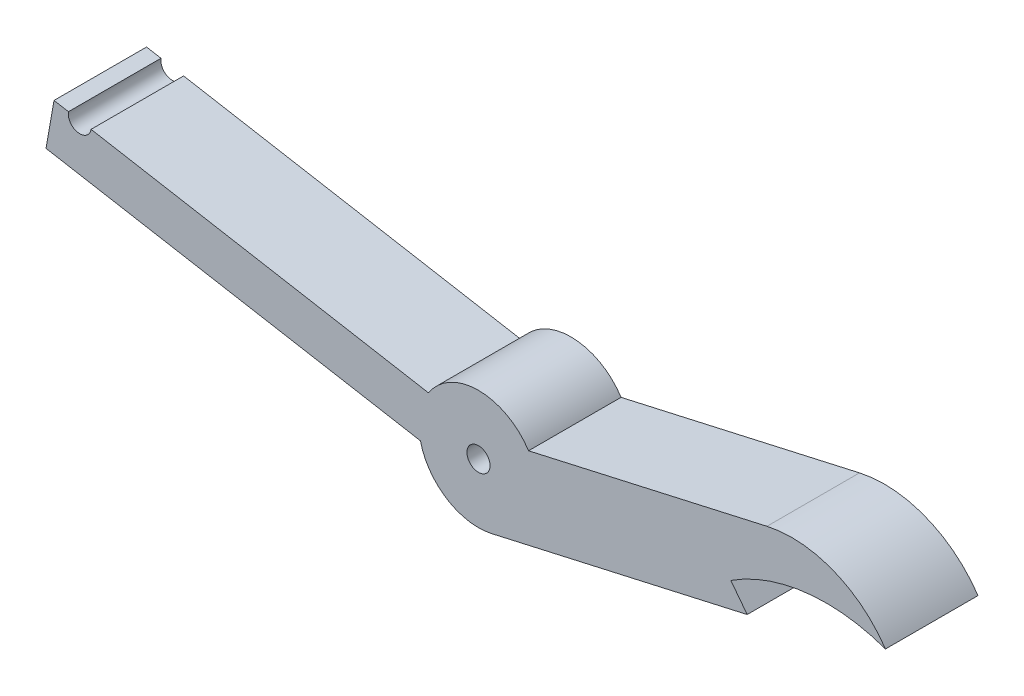
ISO-10303-21;
HEADER;
FILE_DESCRIPTION(('STEP AP214'),'2;1');
FILE_NAME('part.step','',(''),(''),'','','');
FILE_SCHEMA(('AUTOMOTIVE_DESIGN { 1 0 10303 214 1 1 1 1 }'));
ENDSEC;
DATA;
#1=APPLICATION_CONTEXT('core data for automotive mechanical design processes');
#2=APPLICATION_PROTOCOL_DEFINITION('international standard','automotive_design',2000,#1);
#3=PRODUCT_CONTEXT('',#1,'mechanical');
#4=PRODUCT('Part','Part','',(#3));
#5=PRODUCT_RELATED_PRODUCT_CATEGORY('part','',(#4));
#6=PRODUCT_DEFINITION_FORMATION('','',#4);
#7=PRODUCT_DEFINITION_CONTEXT('part definition',#1,'design');
#8=PRODUCT_DEFINITION('design','',#6,#7);
#9=PRODUCT_DEFINITION_SHAPE('','',#8);
#10=(LENGTH_UNIT() NAMED_UNIT(*) SI_UNIT(.MILLI.,.METRE.));
#11=(NAMED_UNIT(*) PLANE_ANGLE_UNIT() SI_UNIT($,.RADIAN.));
#12=(NAMED_UNIT(*) SI_UNIT($,.STERADIAN.) SOLID_ANGLE_UNIT());
#13=UNCERTAINTY_MEASURE_WITH_UNIT(LENGTH_MEASURE(1.E-05),#10,'distance_accuracy_value','');
#14=(GEOMETRIC_REPRESENTATION_CONTEXT(3) GLOBAL_UNCERTAINTY_ASSIGNED_CONTEXT((#13)) GLOBAL_UNIT_ASSIGNED_CONTEXT((#10,
#11,#12)) REPRESENTATION_CONTEXT('',''));
#15=CARTESIAN_POINT('',(0.,0.,0.));
#16=DIRECTION('',(0.,0.,1.));
#17=DIRECTION('',(1.,0.,0.));
#18=AXIS2_PLACEMENT_3D('',#15,#16,#17);
#19=CARTESIAN_POINT('',(0.,0.,6.35));
#20=DIRECTION('',(0.,0.,1.));
#21=DIRECTION('',(1.,0.,0.));
#22=AXIS2_PLACEMENT_3D('',#19,#20,#21);
#23=PLANE('',#22);
#24=CARTESIAN_POINT('',(0.,0.,6.35));
#25=DIRECTION('',(0.,0.,1.));
#26=DIRECTION('',(1.,0.,0.));
#27=AXIS2_PLACEMENT_3D('',#24,#25,#26);
#28=CIRCLE('',#27,8.1661);
#29=CARTESIAN_POINT('',(6.86979140393997,4.4148788518319,6.35));
#30=VERTEX_POINT('',#29);
#31=CARTESIAN_POINT('',(-6.85796712096746,4.43322412897535,6.35));
#32=VERTEX_POINT('',#31);
#33=EDGE_CURVE('E179',#30,#32,#28,.T.);
#34=ORIENTED_EDGE('',*,*,#33,.T.);
#35=DIRECTION('',(-0.984807753012208,0.173648177666931,0.));
#36=VECTOR('',#35,1.);
#37=CARTESIAN_POINT('',(-6.85796712096746,4.43322412897535,6.35));
#38=LINE('',#37,#36);
#39=CARTESIAN_POINT('',(-53.1755197369553,12.600258335558,6.35));
#40=VERTEX_POINT('',#39);
#41=EDGE_CURVE('E107',#32,#40,#38,.T.);
#42=ORIENTED_EDGE('',*,*,#41,.T.);
#43=CARTESIAN_POINT('',(-54.7263949863989,12.8737194857478,6.35));
#44=DIRECTION('',(0.,0.,-1.));
#45=DIRECTION('',(1.,0.,0.));
#46=AXIS2_PLACEMENT_3D('',#43,#44,#45);
#47=CIRCLE('',#46,1.5748);
#48=CARTESIAN_POINT('',(-56.2772702358425,13.1471806359377,6.35));
#49=VERTEX_POINT('',#48);
#50=EDGE_CURVE('E206',#40,#49,#47,.T.);
#51=ORIENTED_EDGE('',*,*,#50,.T.);
#52=DIRECTION('',(-0.984807753012208,0.173648177666931,0.));
#53=VECTOR('',#52,1.);
#54=CARTESIAN_POINT('',(-56.2772702358425,13.1471806359377,6.35));
#55=LINE('',#54,#53);
#56=CARTESIAN_POINT('',(-58.2573191822893,13.4963166883197,6.35));
#57=VERTEX_POINT('',#56);
#58=EDGE_CURVE('E225',#49,#57,#55,.T.);
#59=ORIENTED_EDGE('',*,*,#58,.T.);
#60=DIRECTION('',(-0.173648177666931,-0.984807753012208,0.));
#61=VECTOR('',#60,1.);
#62=CARTESIAN_POINT('',(-58.2573191822893,13.4963166883197,6.35));
#63=LINE('',#62,#61);
#64=CARTESIAN_POINT('',(-59.3599851104743,7.24278745669213,6.35));
#65=VERTEX_POINT('',#64);
#66=EDGE_CURVE('E222',#57,#65,#63,.T.);
#67=ORIENTED_EDGE('',*,*,#66,.T.);
#68=DIRECTION('',(0.984807753012208,-0.17364817766693,0.));
#69=VECTOR('',#68,1.);
#70=CARTESIAN_POINT('',(-7.96063304915247,-1.82030510265216,6.35));
#71=LINE('',#70,#69);
#72=CARTESIAN_POINT('',(-7.96063304915247,-1.82030510265216,6.35));
#73=VERTEX_POINT('',#72);
#74=EDGE_CURVE('E224',#65,#73,#71,.T.);
#75=ORIENTED_EDGE('',*,*,#74,.T.);
#76=CARTESIAN_POINT('',(0.,0.,6.35));
#77=DIRECTION('',(0.,0.,1.));
#78=DIRECTION('',(1.,0.,0.));
#79=AXIS2_PLACEMENT_3D('',#76,#77,#78);
#80=CIRCLE('',#79,8.1661);
#81=CARTESIAN_POINT('',(1.76685632543537,-7.97266630025797,6.35));
#82=VERTEX_POINT('',#81);
#83=EDGE_CURVE('E227',#73,#82,#80,.T.);
#84=ORIENTED_EDGE('',*,*,#83,.T.);
#85=DIRECTION('',(0.975461826345997,0.220168629331548,0.));
#86=VECTOR('',#85,1.);
#87=CARTESIAN_POINT('',(1.76685632543537,-7.97266630025796,6.35));
#88=LINE('',#87,#86);
#89=CARTESIAN_POINT('',(36.8810507217631,-0.0471444176837717,6.35));
#90=VERTEX_POINT('',#89);
#91=EDGE_CURVE('E233',#82,#90,#88,.T.);
#92=ORIENTED_EDGE('',*,*,#91,.T.);
#93=DIRECTION('',(-0.607545349691304,0.794284991718005,0.));
#94=VECTOR('',#93,1.);
#95=CARTESIAN_POINT('',(36.8810507217631,-0.0471444176837717,6.35));
#96=LINE('',#95,#94);
#97=CARTESIAN_POINT('',(34.6351859776387,2.88902596135538,6.35));
#98=VERTEX_POINT('',#97);
#99=EDGE_CURVE('E138',#90,#98,#96,.T.);
#100=ORIENTED_EDGE('',*,*,#99,.T.);
#101=CARTESIAN_POINT('',(47.7363851359241,-17.3746232809441,6.35));
#102=DIRECTION('',(0.,0.,-1.));
#103=DIRECTION('',(-1.,0.,0.));
#104=AXIS2_PLACEMENT_3D('',#101,#102,#103);
#105=CIRCLE('',#104,24.1300000000001);
#106=CARTESIAN_POINT('',(55.8608218217205,5.34652168445081,6.35));
#107=VERTEX_POINT('',#106);
#108=EDGE_CURVE('E132',#98,#107,#105,.T.);
#109=ORIENTED_EDGE('',*,*,#108,.T.);
#110=CARTESIAN_POINT('',(43.0085552868671,-3.31896312374581,6.35));
#111=DIRECTION('',(0.,0.,1.));
#112=DIRECTION('',(-1.,0.,0.));
#113=AXIS2_PLACEMENT_3D('',#110,#111,#112);
#114=CIRCLE('',#113,15.5006897280089);
#115=CARTESIAN_POINT('',(39.5957896757577,11.8013679879604,6.35));
#116=VERTEX_POINT('',#115);
#117=EDGE_CURVE('E136',#107,#116,#114,.T.);
#118=ORIENTED_EDGE('',*,*,#117,.T.);
#119=DIRECTION('',(-0.975461826345997,-0.220168629331548,0.));
#120=VECTOR('',#119,1.);
#121=CARTESIAN_POINT('',(6.86979140393997,4.4148788518319,6.35));
#122=LINE('',#121,#120);
#123=EDGE_CURVE('E52',#116,#30,#122,.T.);
#124=ORIENTED_EDGE('',*,*,#123,.T.);
#125=EDGE_LOOP('',(#34,#42,#51,#59,#67,#75,#84,#92,#100,#109,#118,#124));
#126=FACE_BOUND('',#125,.T.);
#127=CARTESIAN_POINT('',(0.,0.,6.35));
#128=DIRECTION('',(0.,0.,1.));
#129=DIRECTION('',(1.,0.,0.));
#130=AXIS2_PLACEMENT_3D('',#127,#128,#129);
#131=CIRCLE('',#130,1.5875);
#132=CARTESIAN_POINT('',(1.5875,0.,6.35));
#133=VERTEX_POINT('',#132);
#134=EDGE_CURVE('E160',#133,#133,#131,.T.);
#135=ORIENTED_EDGE('',*,*,#134,.F.);
#136=EDGE_LOOP('',(#135));
#137=FACE_BOUND('',#136,.T.);
#138=ADVANCED_FACE('F35',(#126,#137),#23,.T.);
#139=CARTESIAN_POINT('',(0.,0.,-6.35));
#140=DIRECTION('',(0.,0.,1.));
#141=DIRECTION('',(1.,0.,0.));
#142=AXIS2_PLACEMENT_3D('',#139,#140,#141);
#143=PLANE('',#142);
#144=CARTESIAN_POINT('',(0.,0.,-6.35));
#145=DIRECTION('',(0.,0.,1.));
#146=DIRECTION('',(1.,0.,0.));
#147=AXIS2_PLACEMENT_3D('',#144,#145,#146);
#148=CIRCLE('',#147,8.1661);
#149=CARTESIAN_POINT('',(6.86979140393997,4.4148788518319,-6.35));
#150=VERTEX_POINT('',#149);
#151=CARTESIAN_POINT('',(-6.85796712096746,4.43322412897535,-6.35));
#152=VERTEX_POINT('',#151);
#153=EDGE_CURVE('E156',#150,#152,#148,.T.);
#154=ORIENTED_EDGE('',*,*,#153,.F.);
#155=DIRECTION('',(-0.975461826345997,-0.220168629331548,0.));
#156=VECTOR('',#155,1.);
#157=CARTESIAN_POINT('',(6.86979140393997,4.4148788518319,-6.35));
#158=LINE('',#157,#156);
#159=CARTESIAN_POINT('',(39.5957896757577,11.8013679879604,-6.35));
#160=VERTEX_POINT('',#159);
#161=EDGE_CURVE('E99',#160,#150,#158,.T.);
#162=ORIENTED_EDGE('',*,*,#161,.F.);
#163=CARTESIAN_POINT('',(43.0085552868671,-3.31896312374581,-6.35));
#164=DIRECTION('',(0.,0.,1.));
#165=DIRECTION('',(-1.,0.,0.));
#166=AXIS2_PLACEMENT_3D('',#163,#164,#165);
#167=CIRCLE('',#166,15.5006897280089);
#168=CARTESIAN_POINT('',(55.8608218217205,5.34652168445081,-6.35));
#169=VERTEX_POINT('',#168);
#170=EDGE_CURVE('E93',#169,#160,#167,.T.);
#171=ORIENTED_EDGE('',*,*,#170,.F.);
#172=CARTESIAN_POINT('',(47.7363851359241,-17.3746232809441,-6.35));
#173=DIRECTION('',(0.,0.,-1.));
#174=DIRECTION('',(-1.,0.,0.));
#175=AXIS2_PLACEMENT_3D('',#172,#173,#174);
#176=CIRCLE('',#175,24.1300000000001);
#177=CARTESIAN_POINT('',(34.6351859776387,2.88902596135538,-6.35));
#178=VERTEX_POINT('',#177);
#179=EDGE_CURVE('E146',#178,#169,#176,.T.);
#180=ORIENTED_EDGE('',*,*,#179,.F.);
#181=DIRECTION('',(-0.607545349691304,0.794284991718005,0.));
#182=VECTOR('',#181,1.);
#183=CARTESIAN_POINT('',(36.8810507217631,-0.0471444176837717,-6.35));
#184=LINE('',#183,#182);
#185=CARTESIAN_POINT('',(36.8810507217631,-0.0471444176837717,-6.35));
#186=VERTEX_POINT('',#185);
#187=EDGE_CURVE('E174',#186,#178,#184,.T.);
#188=ORIENTED_EDGE('',*,*,#187,.F.);
#189=DIRECTION('',(0.975461826345997,0.220168629331548,0.));
#190=VECTOR('',#189,1.);
#191=CARTESIAN_POINT('',(1.76685632543537,-7.97266630025796,-6.35));
#192=LINE('',#191,#190);
#193=CARTESIAN_POINT('',(1.76685632543537,-7.97266630025797,-6.35));
#194=VERTEX_POINT('',#193);
#195=EDGE_CURVE('E172',#194,#186,#192,.T.);
#196=ORIENTED_EDGE('',*,*,#195,.F.);
#197=CARTESIAN_POINT('',(0.,0.,-6.35));
#198=DIRECTION('',(0.,0.,1.));
#199=DIRECTION('',(1.,0.,0.));
#200=AXIS2_PLACEMENT_3D('',#197,#198,#199);
#201=CIRCLE('',#200,8.1661);
#202=CARTESIAN_POINT('',(-7.96063304915247,-1.82030510265216,-6.35));
#203=VERTEX_POINT('',#202);
#204=EDGE_CURVE('E170',#203,#194,#201,.T.);
#205=ORIENTED_EDGE('',*,*,#204,.F.);
#206=DIRECTION('',(0.984807753012208,-0.17364817766693,0.));
#207=VECTOR('',#206,1.);
#208=CARTESIAN_POINT('',(-7.96063304915247,-1.82030510265216,-6.35));
#209=LINE('',#208,#207);
#210=CARTESIAN_POINT('',(-59.3599851104743,7.24278745669213,-6.35));
#211=VERTEX_POINT('',#210);
#212=EDGE_CURVE('E168',#211,#203,#209,.T.);
#213=ORIENTED_EDGE('',*,*,#212,.F.);
#214=DIRECTION('',(-0.173648177666931,-0.984807753012208,0.));
#215=VECTOR('',#214,1.);
#216=CARTESIAN_POINT('',(-58.2573191822893,13.4963166883197,-6.35));
#217=LINE('',#216,#215);
#218=CARTESIAN_POINT('',(-58.2573191822893,13.4963166883197,-6.35));
#219=VERTEX_POINT('',#218);
#220=EDGE_CURVE('E166',#219,#211,#217,.T.);
#221=ORIENTED_EDGE('',*,*,#220,.F.);
#222=DIRECTION('',(-0.984807753012208,0.173648177666931,0.));
#223=VECTOR('',#222,1.);
#224=CARTESIAN_POINT('',(-56.2772702358425,13.1471806359377,-6.35));
#225=LINE('',#224,#223);
#226=CARTESIAN_POINT('',(-56.2772702358425,13.1471806359377,-6.35));
#227=VERTEX_POINT('',#226);
#228=EDGE_CURVE('E164',#227,#219,#225,.T.);
#229=ORIENTED_EDGE('',*,*,#228,.F.);
#230=CARTESIAN_POINT('',(-54.7263949863989,12.8737194857478,-6.35));
#231=DIRECTION('',(0.,0.,-1.));
#232=DIRECTION('',(1.,0.,0.));
#233=AXIS2_PLACEMENT_3D('',#230,#231,#232);
#234=CIRCLE('',#233,1.5748);
#235=CARTESIAN_POINT('',(-53.1755197369553,12.600258335558,-6.35));
#236=VERTEX_POINT('',#235);
#237=EDGE_CURVE('E162',#236,#227,#234,.T.);
#238=ORIENTED_EDGE('',*,*,#237,.F.);
#239=DIRECTION('',(-0.984807753012208,0.173648177666931,0.));
#240=VECTOR('',#239,1.);
#241=CARTESIAN_POINT('',(-6.85796712096746,4.43322412897535,-6.35));
#242=LINE('',#241,#240);
#243=EDGE_CURVE('E159',#152,#236,#242,.T.);
#244=ORIENTED_EDGE('',*,*,#243,.F.);
#245=EDGE_LOOP('',(#154,#162,#171,#180,#188,#196,#205,#213,#221,#229,#238,#244));
#246=FACE_BOUND('',#245,.T.);
#247=CARTESIAN_POINT('',(0.,0.,-6.35));
#248=DIRECTION('',(0.,0.,1.));
#249=DIRECTION('',(1.,0.,0.));
#250=AXIS2_PLACEMENT_3D('',#247,#248,#249);
#251=CIRCLE('',#250,1.5875);
#252=CARTESIAN_POINT('',(1.5875,0.,-6.35));
#253=VERTEX_POINT('',#252);
#254=EDGE_CURVE('E380',#253,#253,#251,.T.);
#255=ORIENTED_EDGE('',*,*,#254,.T.);
#256=EDGE_LOOP('',(#255));
#257=FACE_BOUND('',#256,.T.);
#258=ADVANCED_FACE('F210',(#246,#257),#143,.F.);
#259=CARTESIAN_POINT('',(0.,0.,6.35));
#260=DIRECTION('',(0.,0.,-1.));
#261=DIRECTION('',(-1.,0.,0.));
#262=AXIS2_PLACEMENT_3D('',#259,#260,#261);
#263=CYLINDRICAL_SURFACE('',#262,8.1661);
#264=ORIENTED_EDGE('',*,*,#153,.T.);
#265=DIRECTION('',(0.,0.,-1.));
#266=VECTOR('',#265,1.);
#267=CARTESIAN_POINT('',(-6.85796712096746,4.43322412897535,6.35));
#268=LINE('',#267,#266);
#269=EDGE_CURVE('E11',#32,#152,#268,.T.);
#270=ORIENTED_EDGE('',*,*,#269,.F.);
#271=ORIENTED_EDGE('',*,*,#33,.F.);
#272=DIRECTION('',(0.,0.,-1.));
#273=VECTOR('',#272,1.);
#274=CARTESIAN_POINT('',(6.86979140393997,4.4148788518319,6.35));
#275=LINE('',#274,#273);
#276=EDGE_CURVE('E152',#30,#150,#275,.T.);
#277=ORIENTED_EDGE('',*,*,#276,.T.);
#278=EDGE_LOOP('',(#264,#270,#271,#277));
#279=FACE_BOUND('',#278,.T.);
#280=ADVANCED_FACE('F37',(#279),#263,.T.);
#281=CARTESIAN_POINT('',(-6.85796712096746,4.43322412897535,6.35));
#282=DIRECTION('',(-0.173648177666931,-0.984807753012208,0.));
#283=DIRECTION('',(0.984807753012208,-0.173648177666931,0.));
#284=AXIS2_PLACEMENT_3D('',#281,#282,#283);
#285=PLANE('',#284);
#286=ORIENTED_EDGE('',*,*,#243,.T.);
#287=DIRECTION('',(0.,0.,-1.));
#288=VECTOR('',#287,1.);
#289=CARTESIAN_POINT('',(-53.1755197369553,12.600258335558,6.35));
#290=LINE('',#289,#288);
#291=EDGE_CURVE('E44',#40,#236,#290,.T.);
#292=ORIENTED_EDGE('',*,*,#291,.F.);
#293=ORIENTED_EDGE('',*,*,#41,.F.);
#294=ORIENTED_EDGE('',*,*,#269,.T.);
#295=EDGE_LOOP('',(#286,#292,#293,#294));
#296=FACE_BOUND('',#295,.T.);
#297=ADVANCED_FACE('F267',(#296),#285,.F.);
#298=CARTESIAN_POINT('',(-54.7263949863989,12.8737194857478,6.35));
#299=DIRECTION('',(0.,0.,-1.));
#300=DIRECTION('',(-1.,0.,0.));
#301=AXIS2_PLACEMENT_3D('',#298,#299,#300);
#302=CYLINDRICAL_SURFACE('',#301,1.5748);
#303=ORIENTED_EDGE('',*,*,#237,.T.);
#304=DIRECTION('',(0.,0.,-1.));
#305=VECTOR('',#304,1.);
#306=CARTESIAN_POINT('',(-56.2772702358425,13.1471806359377,6.35));
#307=LINE('',#306,#305);
#308=EDGE_CURVE('E198',#49,#227,#307,.T.);
#309=ORIENTED_EDGE('',*,*,#308,.F.);
#310=ORIENTED_EDGE('',*,*,#50,.F.);
#311=ORIENTED_EDGE('',*,*,#291,.T.);
#312=EDGE_LOOP('',(#303,#309,#310,#311));
#313=FACE_BOUND('',#312,.T.);
#314=ADVANCED_FACE('F204',(#313),#302,.F.);
#315=CARTESIAN_POINT('',(-56.2772702358425,13.1471806359377,6.35));
#316=DIRECTION('',(-0.173648177666931,-0.984807753012208,0.));
#317=DIRECTION('',(0.984807753012208,-0.173648177666931,0.));
#318=AXIS2_PLACEMENT_3D('',#315,#316,#317);
#319=PLANE('',#318);
#320=ORIENTED_EDGE('',*,*,#228,.T.);
#321=DIRECTION('',(0.,0.,-1.));
#322=VECTOR('',#321,1.);
#323=CARTESIAN_POINT('',(-58.2573191822893,13.4963166883197,6.35));
#324=LINE('',#323,#322);
#325=EDGE_CURVE('E195',#57,#219,#324,.T.);
#326=ORIENTED_EDGE('',*,*,#325,.F.);
#327=ORIENTED_EDGE('',*,*,#58,.F.);
#328=ORIENTED_EDGE('',*,*,#308,.T.);
#329=EDGE_LOOP('',(#320,#326,#327,#328));
#330=FACE_BOUND('',#329,.T.);
#331=ADVANCED_FACE('F216',(#330),#319,.F.);
#332=CARTESIAN_POINT('',(-58.2573191822893,13.4963166883197,6.35));
#333=DIRECTION('',(0.984807753012208,-0.173648177666931,0.));
#334=DIRECTION('',(0.173648177666931,0.984807753012208,0.));
#335=AXIS2_PLACEMENT_3D('',#332,#333,#334);
#336=PLANE('',#335);
#337=ORIENTED_EDGE('',*,*,#220,.T.);
#338=DIRECTION('',(0.,0.,-1.));
#339=VECTOR('',#338,1.);
#340=CARTESIAN_POINT('',(-59.3599851104743,7.24278745669213,6.35));
#341=LINE('',#340,#339);
#342=EDGE_CURVE('E192',#65,#211,#341,.T.);
#343=ORIENTED_EDGE('',*,*,#342,.F.);
#344=ORIENTED_EDGE('',*,*,#66,.F.);
#345=ORIENTED_EDGE('',*,*,#325,.T.);
#346=EDGE_LOOP('',(#337,#343,#344,#345));
#347=FACE_BOUND('',#346,.T.);
#348=ADVANCED_FACE('F220',(#347),#336,.F.);
#349=CARTESIAN_POINT('',(-7.96063304915247,-1.82030510265216,6.35));
#350=DIRECTION('',(0.17364817766693,0.984807753012208,0.));
#351=DIRECTION('',(-0.984807753012208,0.17364817766693,0.));
#352=AXIS2_PLACEMENT_3D('',#349,#350,#351);
#353=PLANE('',#352);
#354=ORIENTED_EDGE('',*,*,#212,.T.);
#355=DIRECTION('',(0.,0.,-1.));
#356=VECTOR('',#355,1.);
#357=CARTESIAN_POINT('',(-7.96063304915247,-1.82030510265216,6.35));
#358=LINE('',#357,#356);
#359=EDGE_CURVE('E189',#73,#203,#358,.T.);
#360=ORIENTED_EDGE('',*,*,#359,.F.);
#361=ORIENTED_EDGE('',*,*,#74,.F.);
#362=ORIENTED_EDGE('',*,*,#342,.T.);
#363=EDGE_LOOP('',(#354,#360,#361,#362));
#364=FACE_BOUND('',#363,.T.);
#365=ADVANCED_FACE('F280',(#364),#353,.F.);
#366=CARTESIAN_POINT('',(0.,0.,6.35));
#367=DIRECTION('',(0.,0.,-1.));
#368=DIRECTION('',(-1.,0.,0.));
#369=AXIS2_PLACEMENT_3D('',#366,#367,#368);
#370=CYLINDRICAL_SURFACE('',#369,8.1661);
#371=ORIENTED_EDGE('',*,*,#204,.T.);
#372=DIRECTION('',(0.,0.,-1.));
#373=VECTOR('',#372,1.);
#374=CARTESIAN_POINT('',(1.76685632543537,-7.97266630025797,6.35));
#375=LINE('',#374,#373);
#376=EDGE_CURVE('E186',#82,#194,#375,.T.);
#377=ORIENTED_EDGE('',*,*,#376,.F.);
#378=ORIENTED_EDGE('',*,*,#83,.F.);
#379=ORIENTED_EDGE('',*,*,#359,.T.);
#380=EDGE_LOOP('',(#371,#377,#378,#379));
#381=FACE_BOUND('',#380,.T.);
#382=ADVANCED_FACE('F283',(#381),#370,.T.);
#383=CARTESIAN_POINT('',(1.76685632543537,-7.97266630025796,6.35));
#384=DIRECTION('',(-0.220168629331548,0.975461826345997,0.));
#385=DIRECTION('',(-0.975461826345997,-0.220168629331548,0.));
#386=AXIS2_PLACEMENT_3D('',#383,#384,#385);
#387=PLANE('',#386);
#388=ORIENTED_EDGE('',*,*,#195,.T.);
#389=DIRECTION('',(0.,0.,-1.));
#390=VECTOR('',#389,1.);
#391=CARTESIAN_POINT('',(36.8810507217631,-0.0471444176837717,6.35));
#392=LINE('',#391,#390);
#393=EDGE_CURVE('E183',#90,#186,#392,.T.);
#394=ORIENTED_EDGE('',*,*,#393,.F.);
#395=ORIENTED_EDGE('',*,*,#91,.F.);
#396=ORIENTED_EDGE('',*,*,#376,.T.);
#397=EDGE_LOOP('',(#388,#394,#395,#396));
#398=FACE_BOUND('',#397,.T.);
#399=ADVANCED_FACE('F239',(#398),#387,.F.);
#400=CARTESIAN_POINT('',(36.8810507217631,-0.0471444176837717,6.35));
#401=DIRECTION('',(-0.794284991718005,-0.607545349691304,0.));
#402=DIRECTION('',(0.607545349691304,-0.794284991718005,0.));
#403=AXIS2_PLACEMENT_3D('',#400,#401,#402);
#404=PLANE('',#403);
#405=ORIENTED_EDGE('',*,*,#187,.T.);
#406=DIRECTION('',(0.,0.,-1.));
#407=VECTOR('',#406,1.);
#408=CARTESIAN_POINT('',(34.6351859776387,2.88902596135538,6.35));
#409=LINE('',#408,#407);
#410=EDGE_CURVE('E147',#98,#178,#409,.T.);
#411=ORIENTED_EDGE('',*,*,#410,.F.);
#412=ORIENTED_EDGE('',*,*,#99,.F.);
#413=ORIENTED_EDGE('',*,*,#393,.T.);
#414=EDGE_LOOP('',(#405,#411,#412,#413));
#415=FACE_BOUND('',#414,.T.);
#416=ADVANCED_FACE('F243',(#415),#404,.F.);
#417=CARTESIAN_POINT('',(47.7363851359241,-17.3746232809441,6.35));
#418=DIRECTION('',(0.,0.,-1.));
#419=DIRECTION('',(-1.,0.,0.));
#420=AXIS2_PLACEMENT_3D('',#417,#418,#419);
#421=CYLINDRICAL_SURFACE('',#420,24.1300000000001);
#422=ORIENTED_EDGE('',*,*,#179,.T.);
#423=DIRECTION('',(0.,0.,-1.));
#424=VECTOR('',#423,1.);
#425=CARTESIAN_POINT('',(55.8608218217205,5.34652168445081,6.35));
#426=LINE('',#425,#424);
#427=EDGE_CURVE('E143',#107,#169,#426,.T.);
#428=ORIENTED_EDGE('',*,*,#427,.F.);
#429=ORIENTED_EDGE('',*,*,#108,.F.);
#430=ORIENTED_EDGE('',*,*,#410,.T.);
#431=EDGE_LOOP('',(#422,#428,#429,#430));
#432=FACE_BOUND('',#431,.T.);
#433=ADVANCED_FACE('F144',(#432),#421,.F.);
#434=CARTESIAN_POINT('',(43.0085552868671,-3.31896312374581,6.35));
#435=DIRECTION('',(0.,0.,-1.));
#436=DIRECTION('',(-1.,0.,0.));
#437=AXIS2_PLACEMENT_3D('',#434,#435,#436);
#438=CYLINDRICAL_SURFACE('',#437,15.5006897280089);
#439=ORIENTED_EDGE('',*,*,#170,.T.);
#440=DIRECTION('',(0.,0.,-1.));
#441=VECTOR('',#440,1.);
#442=CARTESIAN_POINT('',(39.5957896757577,11.8013679879604,6.35));
#443=LINE('',#442,#441);
#444=EDGE_CURVE('E148',#116,#160,#443,.T.);
#445=ORIENTED_EDGE('',*,*,#444,.F.);
#446=ORIENTED_EDGE('',*,*,#117,.F.);
#447=ORIENTED_EDGE('',*,*,#427,.T.);
#448=EDGE_LOOP('',(#439,#445,#446,#447));
#449=FACE_BOUND('',#448,.T.);
#450=ADVANCED_FACE('F150',(#449),#438,.T.);
#451=CARTESIAN_POINT('',(6.86979140393997,4.4148788518319,6.35));
#452=DIRECTION('',(0.220168629331548,-0.975461826345997,0.));
#453=DIRECTION('',(0.975461826345997,0.220168629331548,0.));
#454=AXIS2_PLACEMENT_3D('',#451,#452,#453);
#455=PLANE('',#454);
#456=ORIENTED_EDGE('',*,*,#161,.T.);
#457=ORIENTED_EDGE('',*,*,#276,.F.);
#458=ORIENTED_EDGE('',*,*,#123,.F.);
#459=ORIENTED_EDGE('',*,*,#444,.T.);
#460=EDGE_LOOP('',(#456,#457,#458,#459));
#461=FACE_BOUND('',#460,.T.);
#462=ADVANCED_FACE('F247',(#461),#455,.F.);
#463=CARTESIAN_POINT('',(0.,0.,6.35));
#464=DIRECTION('',(0.,0.,-1.));
#465=DIRECTION('',(-1.,0.,0.));
#466=AXIS2_PLACEMENT_3D('',#463,#464,#465);
#467=CYLINDRICAL_SURFACE('',#466,1.5875);
#468=ORIENTED_EDGE('',*,*,#134,.T.);
#469=EDGE_LOOP('',(#468));
#470=FACE_BOUND('',#469,.T.);
#471=ORIENTED_EDGE('',*,*,#254,.F.);
#472=EDGE_LOOP('',(#471));
#473=FACE_BOUND('',#472,.T.);
#474=ADVANCED_FACE('F249',(#470,#473),#467,.F.);
#475=CLOSED_SHELL('',(#138,#258,#280,#297,#314,#331,#348,#365,#382,#399,#416,#433,#450,#462,#474));
#476=MANIFOLD_SOLID_BREP('B2',#475);
#477=ADVANCED_BREP_SHAPE_REPRESENTATION('',(#18,#476),#14);
#478=SHAPE_DEFINITION_REPRESENTATION(#9,#477);
ENDSEC;
END-ISO-10303-21;
